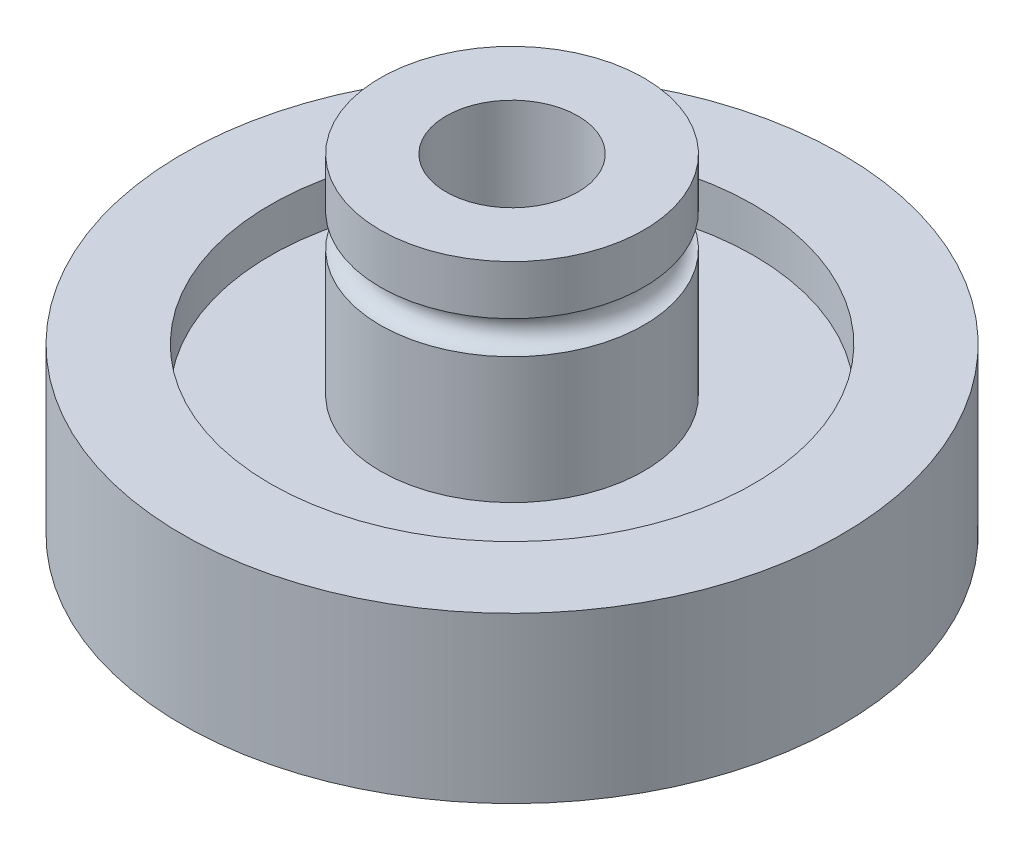
ISO-10303-21;
HEADER;
FILE_DESCRIPTION(('STEP AP214'),'2;1');
FILE_NAME('part.step','',(''),(''),'','','');
FILE_SCHEMA(('AUTOMOTIVE_DESIGN { 1 0 10303 214 1 1 1 1 }'));
ENDSEC;
DATA;
#1=APPLICATION_CONTEXT('core data for automotive mechanical design processes');
#2=APPLICATION_PROTOCOL_DEFINITION('international standard','automotive_design',2000,#1);
#3=PRODUCT_CONTEXT('',#1,'mechanical');
#4=PRODUCT('Part','Part','',(#3));
#5=PRODUCT_RELATED_PRODUCT_CATEGORY('part','',(#4));
#6=PRODUCT_DEFINITION_FORMATION('','',#4);
#7=PRODUCT_DEFINITION_CONTEXT('part definition',#1,'design');
#8=PRODUCT_DEFINITION('design','',#6,#7);
#9=PRODUCT_DEFINITION_SHAPE('','',#8);
#10=(LENGTH_UNIT() NAMED_UNIT(*) SI_UNIT(.MILLI.,.METRE.));
#11=(NAMED_UNIT(*) PLANE_ANGLE_UNIT() SI_UNIT($,.RADIAN.));
#12=(NAMED_UNIT(*) SI_UNIT($,.STERADIAN.) SOLID_ANGLE_UNIT());
#13=UNCERTAINTY_MEASURE_WITH_UNIT(LENGTH_MEASURE(1.E-05),#10,'distance_accuracy_value','');
#14=(GEOMETRIC_REPRESENTATION_CONTEXT(3) GLOBAL_UNCERTAINTY_ASSIGNED_CONTEXT((#13)) GLOBAL_UNIT_ASSIGNED_CONTEXT((#10,
#11,#12)) REPRESENTATION_CONTEXT('',''));
#15=CARTESIAN_POINT('',(0.,0.,0.));
#16=DIRECTION('',(0.,0.,1.));
#17=DIRECTION('',(1.,0.,0.));
#18=AXIS2_PLACEMENT_3D('',#15,#16,#17);
#19=CARTESIAN_POINT('',(-30.,0.,0.));
#20=DIRECTION('',(0.,1.,0.));
#21=DIRECTION('',(0.,0.,1.));
#22=AXIS2_PLACEMENT_3D('',#19,#20,#21);
#23=PLANE('',#22);
#24=CARTESIAN_POINT('',(0.,0.,0.));
#25=DIRECTION('',(0.,-1.,0.));
#26=DIRECTION('',(0.,0.,-1.));
#27=AXIS2_PLACEMENT_3D('',#24,#25,#26);
#28=CIRCLE('',#27,6.);
#29=CARTESIAN_POINT('',(0.,0.,-6.));
#30=VERTEX_POINT('',#29);
#31=EDGE_CURVE('E80',#30,#30,#28,.T.);
#32=ORIENTED_EDGE('',*,*,#31,.F.);
#33=EDGE_LOOP('',(#32));
#34=FACE_BOUND('',#33,.T.);
#35=CARTESIAN_POINT('',(0.,0.,0.));
#36=DIRECTION('',(0.,-1.,0.));
#37=DIRECTION('',(0.,0.,-1.));
#38=AXIS2_PLACEMENT_3D('',#35,#36,#37);
#39=CIRCLE('',#38,12.);
#40=CARTESIAN_POINT('',(0.,0.,-12.));
#41=VERTEX_POINT('',#40);
#42=EDGE_CURVE('E69',#41,#41,#39,.T.);
#43=ORIENTED_EDGE('',*,*,#42,.T.);
#44=EDGE_LOOP('',(#43));
#45=FACE_BOUND('',#44,.T.);
#46=ADVANCED_FACE('F33',(#34,#45),#23,.F.);
#47=CARTESIAN_POINT('',(0.,-28.5077046514816,0.));
#48=DIRECTION('',(0.,-1.,0.));
#49=DIRECTION('',(0.,0.,-1.));
#50=AXIS2_PLACEMENT_3D('',#47,#48,#49);
#51=CYLINDRICAL_SURFACE('',#50,12.);
#52=CARTESIAN_POINT('',(0.,22.5,0.));
#53=DIRECTION('',(0.,1.,0.));
#54=DIRECTION('',(0.,0.,1.));
#55=AXIS2_PLACEMENT_3D('',#52,#53,#54);
#56=CIRCLE('',#55,12.);
#57=CARTESIAN_POINT('',(0.,22.5,12.));
#58=VERTEX_POINT('',#57);
#59=EDGE_CURVE('E37',#58,#58,#56,.T.);
#60=ORIENTED_EDGE('',*,*,#59,.F.);
#61=EDGE_LOOP('',(#60));
#62=FACE_BOUND('',#61,.T.);
#63=CARTESIAN_POINT('',(0.,11.,0.));
#64=DIRECTION('',(0.,-1.,0.));
#65=DIRECTION('',(0.,0.,-1.));
#66=AXIS2_PLACEMENT_3D('',#63,#64,#65);
#67=CIRCLE('',#66,12.);
#68=CARTESIAN_POINT('',(0.,11.,-12.));
#69=VERTEX_POINT('',#68);
#70=EDGE_CURVE('E57',#69,#69,#67,.T.);
#71=ORIENTED_EDGE('',*,*,#70,.F.);
#72=EDGE_LOOP('',(#71));
#73=FACE_BOUND('',#72,.T.);
#74=ADVANCED_FACE('F115',(#62,#73),#51,.T.);
#75=CARTESIAN_POINT('',(0.,30.,0.));
#76=DIRECTION('',(0.,-1.,0.));
#77=DIRECTION('',(0.,0.,-1.));
#78=AXIS2_PLACEMENT_3D('',#75,#76,#77);
#79=CIRCLE('',#78,12.);
#80=CARTESIAN_POINT('',(0.,30.,-12.));
#81=VERTEX_POINT('',#80);
#82=EDGE_CURVE('E10',#81,#81,#79,.T.);
#83=ORIENTED_EDGE('',*,*,#82,.T.);
#84=EDGE_LOOP('',(#83));
#85=FACE_BOUND('',#84,.T.);
#86=CARTESIAN_POINT('',(0.,25.5,0.));
#87=DIRECTION('',(0.,-1.,0.));
#88=DIRECTION('',(0.,0.,-1.));
#89=AXIS2_PLACEMENT_3D('',#86,#87,#88);
#90=CIRCLE('',#89,12.);
#91=CARTESIAN_POINT('',(0.,25.5,-12.));
#92=VERTEX_POINT('',#91);
#93=EDGE_CURVE('E49',#92,#92,#90,.T.);
#94=ORIENTED_EDGE('',*,*,#93,.F.);
#95=EDGE_LOOP('',(#94));
#96=FACE_BOUND('',#95,.T.);
#97=ADVANCED_FACE('F120',(#85,#96),#51,.T.);
#98=CARTESIAN_POINT('',(-6.,30.,0.));
#99=DIRECTION('',(0.,-1.,0.));
#100=DIRECTION('',(0.,0.,-1.));
#101=AXIS2_PLACEMENT_3D('',#98,#99,#100);
#102=PLANE('',#101);
#103=ORIENTED_EDGE('',*,*,#82,.F.);
#104=EDGE_LOOP('',(#103));
#105=FACE_BOUND('',#104,.T.);
#106=CARTESIAN_POINT('',(0.,30.,0.));
#107=DIRECTION('',(0.,-1.,0.));
#108=DIRECTION('',(0.,0.,-1.));
#109=AXIS2_PLACEMENT_3D('',#106,#107,#108);
#110=CIRCLE('',#109,6.);
#111=CARTESIAN_POINT('',(0.,30.,-6.));
#112=VERTEX_POINT('',#111);
#113=EDGE_CURVE('E55',#112,#112,#110,.T.);
#114=ORIENTED_EDGE('',*,*,#113,.T.);
#115=EDGE_LOOP('',(#114));
#116=FACE_BOUND('',#115,.T.);
#117=ADVANCED_FACE('F35',(#105,#116),#102,.F.);
#118=CARTESIAN_POINT('',(0.,-28.5077046514816,0.));
#119=DIRECTION('',(0.,-1.,0.));
#120=DIRECTION('',(0.,0.,-1.));
#121=AXIS2_PLACEMENT_3D('',#118,#119,#120);
#122=CYLINDRICAL_SURFACE('',#121,6.);
#123=ORIENTED_EDGE('',*,*,#113,.F.);
#124=EDGE_LOOP('',(#123));
#125=FACE_BOUND('',#124,.T.);
#126=ORIENTED_EDGE('',*,*,#31,.T.);
#127=EDGE_LOOP('',(#126));
#128=FACE_BOUND('',#127,.T.);
#129=ADVANCED_FACE('F125',(#125,#128),#122,.F.);
#130=CARTESIAN_POINT('',(0.,24.,0.));
#131=DIRECTION('',(0.,-1.,0.));
#132=DIRECTION('',(0.,0.,-1.));
#133=AXIS2_PLACEMENT_3D('',#130,#131,#132);
#134=TOROIDAL_SURFACE('',#133,12.,1.5);
#135=ORIENTED_EDGE('',*,*,#93,.T.);
#136=EDGE_LOOP('',(#135));
#137=FACE_BOUND('',#136,.T.);
#138=ORIENTED_EDGE('',*,*,#59,.T.);
#139=EDGE_LOOP('',(#138));
#140=FACE_BOUND('',#139,.T.);
#141=ADVANCED_FACE('F128',(#137,#140),#134,.F.);
#142=CARTESIAN_POINT('',(0.,0.,0.));
#143=DIRECTION('',(0.,-1.,0.));
#144=DIRECTION('',(0.,0.,-1.));
#145=AXIS2_PLACEMENT_3D('',#142,#143,#144);
#146=CYLINDRICAL_SURFACE('',#145,22.);
#147=CARTESIAN_POINT('',(0.,0.,0.));
#148=DIRECTION('',(0.,-1.,0.));
#149=DIRECTION('',(0.,0.,-1.));
#150=AXIS2_PLACEMENT_3D('',#147,#148,#149);
#151=CIRCLE('',#150,22.);
#152=CARTESIAN_POINT('',(0.,0.,-22.));
#153=VERTEX_POINT('',#152);
#154=EDGE_CURVE('E66',#153,#153,#151,.T.);
#155=ORIENTED_EDGE('',*,*,#154,.T.);
#156=EDGE_LOOP('',(#155));
#157=FACE_BOUND('',#156,.T.);
#158=CARTESIAN_POINT('',(0.,4.,0.));
#159=DIRECTION('',(0.,-1.,0.));
#160=DIRECTION('',(0.,0.,-1.));
#161=AXIS2_PLACEMENT_3D('',#158,#159,#160);
#162=CIRCLE('',#161,22.);
#163=CARTESIAN_POINT('',(0.,4.,-22.));
#164=VERTEX_POINT('',#163);
#165=EDGE_CURVE('E75',#164,#164,#162,.T.);
#166=ORIENTED_EDGE('',*,*,#165,.F.);
#167=EDGE_LOOP('',(#166));
#168=FACE_BOUND('',#167,.T.);
#169=ADVANCED_FACE('F132',(#157,#168),#146,.F.);
#170=CARTESIAN_POINT('',(-22.,4.,0.));
#171=DIRECTION('',(0.,-1.,0.));
#172=DIRECTION('',(0.,0.,-1.));
#173=AXIS2_PLACEMENT_3D('',#170,#171,#172);
#174=PLANE('',#173);
#175=ORIENTED_EDGE('',*,*,#165,.T.);
#176=EDGE_LOOP('',(#175));
#177=FACE_BOUND('',#176,.T.);
#178=CARTESIAN_POINT('',(0.,4.,0.));
#179=DIRECTION('',(0.,-1.,0.));
#180=DIRECTION('',(0.,0.,-1.));
#181=AXIS2_PLACEMENT_3D('',#178,#179,#180);
#182=CIRCLE('',#181,12.);
#183=CARTESIAN_POINT('',(0.,4.,-12.));
#184=VERTEX_POINT('',#183);
#185=EDGE_CURVE('E72',#184,#184,#182,.T.);
#186=ORIENTED_EDGE('',*,*,#185,.F.);
#187=EDGE_LOOP('',(#186));
#188=FACE_BOUND('',#187,.T.);
#189=ADVANCED_FACE('F135',(#177,#188),#174,.T.);
#190=CARTESIAN_POINT('',(0.,0.,0.));
#191=DIRECTION('',(0.,-1.,0.));
#192=DIRECTION('',(0.,0.,-1.));
#193=AXIS2_PLACEMENT_3D('',#190,#191,#192);
#194=CYLINDRICAL_SURFACE('',#193,12.);
#195=ORIENTED_EDGE('',*,*,#185,.T.);
#196=EDGE_LOOP('',(#195));
#197=FACE_BOUND('',#196,.T.);
#198=ORIENTED_EDGE('',*,*,#42,.F.);
#199=EDGE_LOOP('',(#198));
#200=FACE_BOUND('',#199,.T.);
#201=ADVANCED_FACE('F97',(#197,#200),#194,.T.);
#202=CARTESIAN_POINT('',(-12.,15.,0.));
#203=DIRECTION('',(0.,-1.,0.));
#204=DIRECTION('',(0.,0.,-1.));
#205=AXIS2_PLACEMENT_3D('',#202,#203,#204);
#206=PLANE('',#205);
#207=CARTESIAN_POINT('',(0.,15.,0.));
#208=DIRECTION('',(0.,-1.,0.));
#209=DIRECTION('',(0.,0.,-1.));
#210=AXIS2_PLACEMENT_3D('',#207,#208,#209);
#211=CIRCLE('',#210,30.);
#212=CARTESIAN_POINT('',(0.,15.,-30.));
#213=VERTEX_POINT('',#212);
#214=EDGE_CURVE('E41',#213,#213,#211,.T.);
#215=ORIENTED_EDGE('',*,*,#214,.F.);
#216=EDGE_LOOP('',(#215));
#217=FACE_BOUND('',#216,.T.);
#218=CARTESIAN_POINT('',(0.,15.,0.));
#219=DIRECTION('',(0.,-1.,0.));
#220=DIRECTION('',(0.,0.,-1.));
#221=AXIS2_PLACEMENT_3D('',#218,#219,#220);
#222=CIRCLE('',#221,22.);
#223=CARTESIAN_POINT('',(0.,15.,-22.));
#224=VERTEX_POINT('',#223);
#225=EDGE_CURVE('E62',#224,#224,#222,.T.);
#226=ORIENTED_EDGE('',*,*,#225,.T.);
#227=EDGE_LOOP('',(#226));
#228=FACE_BOUND('',#227,.T.);
#229=ADVANCED_FACE('F91',(#217,#228),#206,.F.);
#230=CARTESIAN_POINT('',(0.,-28.5077046514816,0.));
#231=DIRECTION('',(0.,-1.,0.));
#232=DIRECTION('',(0.,0.,-1.));
#233=AXIS2_PLACEMENT_3D('',#230,#231,#232);
#234=CYLINDRICAL_SURFACE('',#233,30.);
#235=CARTESIAN_POINT('',(0.,0.,0.));
#236=DIRECTION('',(0.,-1.,0.));
#237=DIRECTION('',(0.,0.,-1.));
#238=AXIS2_PLACEMENT_3D('',#235,#236,#237);
#239=CIRCLE('',#238,30.);
#240=CARTESIAN_POINT('',(0.,0.,-30.));
#241=VERTEX_POINT('',#240);
#242=EDGE_CURVE('E46',#241,#241,#239,.T.);
#243=ORIENTED_EDGE('',*,*,#242,.F.);
#244=EDGE_LOOP('',(#243));
#245=FACE_BOUND('',#244,.T.);
#246=ORIENTED_EDGE('',*,*,#214,.T.);
#247=EDGE_LOOP('',(#246));
#248=FACE_BOUND('',#247,.T.);
#249=ADVANCED_FACE('F88',(#245,#248),#234,.T.);
#250=ORIENTED_EDGE('',*,*,#242,.T.);
#251=EDGE_LOOP('',(#250));
#252=FACE_BOUND('',#251,.T.);
#253=ORIENTED_EDGE('',*,*,#154,.F.);
#254=EDGE_LOOP('',(#253));
#255=FACE_BOUND('',#254,.T.);
#256=ADVANCED_FACE('F85',(#252,#255),#23,.F.);
#257=CARTESIAN_POINT('',(0.,0.,0.));
#258=DIRECTION('',(0.,-1.,0.));
#259=DIRECTION('',(0.,0.,-1.));
#260=AXIS2_PLACEMENT_3D('',#257,#258,#259);
#261=CYLINDRICAL_SURFACE('',#260,22.);
#262=CARTESIAN_POINT('',(0.,11.,0.));
#263=DIRECTION('',(0.,-1.,0.));
#264=DIRECTION('',(0.,0.,-1.));
#265=AXIS2_PLACEMENT_3D('',#262,#263,#264);
#266=CIRCLE('',#265,22.);
#267=CARTESIAN_POINT('',(0.,11.,-22.));
#268=VERTEX_POINT('',#267);
#269=EDGE_CURVE('E51',#268,#268,#266,.T.);
#270=ORIENTED_EDGE('',*,*,#269,.T.);
#271=EDGE_LOOP('',(#270));
#272=FACE_BOUND('',#271,.T.);
#273=ORIENTED_EDGE('',*,*,#225,.F.);
#274=EDGE_LOOP('',(#273));
#275=FACE_BOUND('',#274,.T.);
#276=ADVANCED_FACE('F102',(#272,#275),#261,.F.);
#277=CARTESIAN_POINT('',(-22.,11.,0.));
#278=DIRECTION('',(0.,1.,0.));
#279=DIRECTION('',(0.,0.,1.));
#280=AXIS2_PLACEMENT_3D('',#277,#278,#279);
#281=PLANE('',#280);
#282=ORIENTED_EDGE('',*,*,#70,.T.);
#283=EDGE_LOOP('',(#282));
#284=FACE_BOUND('',#283,.T.);
#285=ORIENTED_EDGE('',*,*,#269,.F.);
#286=EDGE_LOOP('',(#285));
#287=FACE_BOUND('',#286,.T.);
#288=ADVANCED_FACE('F104',(#284,#287),#281,.T.);
#289=CLOSED_SHELL('',(#46,#74,#97,#117,#129,#141,#169,#189,#201,#229,#249,#256,#276,#288));
#290=MANIFOLD_SOLID_BREP('B2',#289);
#291=ADVANCED_BREP_SHAPE_REPRESENTATION('',(#18,#290),#14);
#292=SHAPE_DEFINITION_REPRESENTATION(#9,#291);
ENDSEC;
END-ISO-10303-21;
